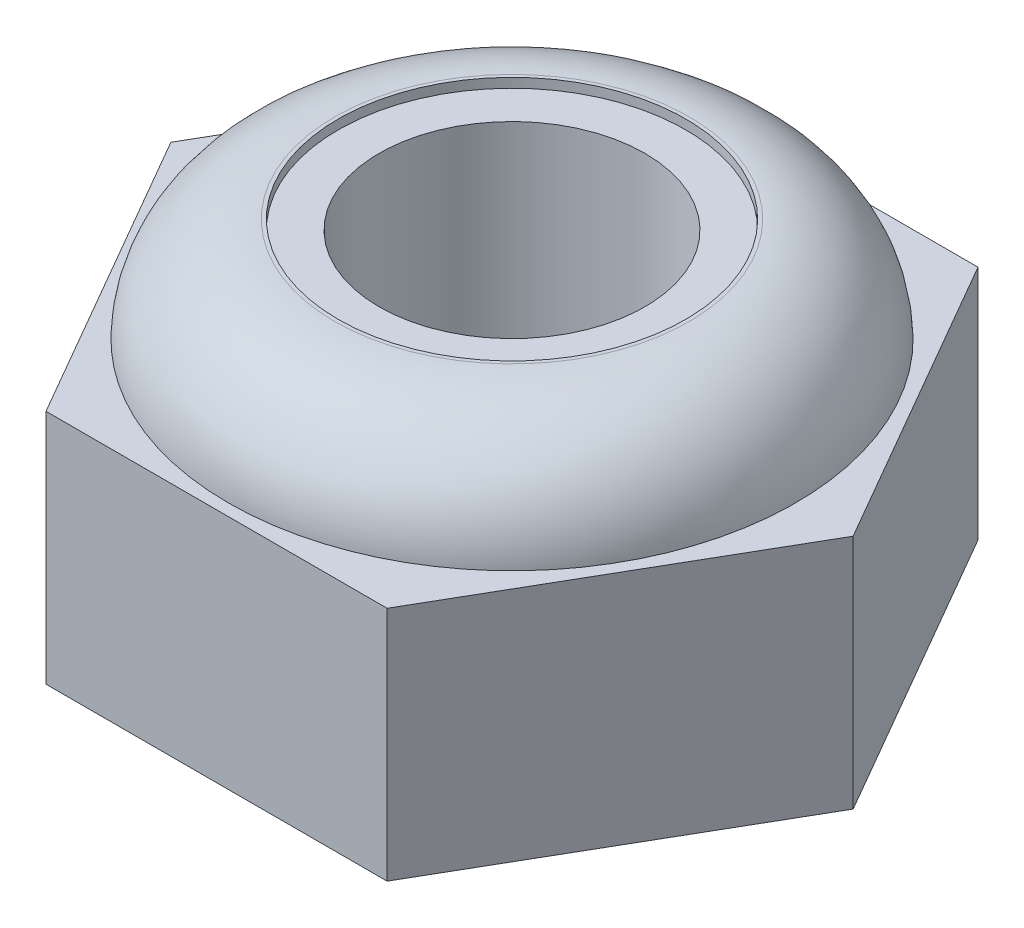
ISO-10303-21;
HEADER;
FILE_DESCRIPTION(('STEP AP214'),'2;1');
FILE_NAME('part.step','',(''),(''),'','','');
FILE_SCHEMA(('AUTOMOTIVE_DESIGN { 1 0 10303 214 1 1 1 1 }'));
ENDSEC;
DATA;
#1=APPLICATION_CONTEXT('core data for automotive mechanical design processes');
#2=APPLICATION_PROTOCOL_DEFINITION('international standard','automotive_design',2000,#1);
#3=PRODUCT_CONTEXT('',#1,'mechanical');
#4=PRODUCT('Part','Part','',(#3));
#5=PRODUCT_RELATED_PRODUCT_CATEGORY('part','',(#4));
#6=PRODUCT_DEFINITION_FORMATION('','',#4);
#7=PRODUCT_DEFINITION_CONTEXT('part definition',#1,'design');
#8=PRODUCT_DEFINITION('design','',#6,#7);
#9=PRODUCT_DEFINITION_SHAPE('','',#8);
#10=(LENGTH_UNIT() NAMED_UNIT(*) SI_UNIT(.MILLI.,.METRE.));
#11=(NAMED_UNIT(*) PLANE_ANGLE_UNIT() SI_UNIT($,.RADIAN.));
#12=(NAMED_UNIT(*) SI_UNIT($,.STERADIAN.) SOLID_ANGLE_UNIT());
#13=UNCERTAINTY_MEASURE_WITH_UNIT(LENGTH_MEASURE(1.E-05),#10,'distance_accuracy_value','');
#14=(GEOMETRIC_REPRESENTATION_CONTEXT(3) GLOBAL_UNCERTAINTY_ASSIGNED_CONTEXT((#13)) GLOBAL_UNIT_ASSIGNED_CONTEXT((#10,
#11,#12)) REPRESENTATION_CONTEXT('',''));
#15=CARTESIAN_POINT('',(0.,0.,0.));
#16=DIRECTION('',(0.,0.,1.));
#17=DIRECTION('',(1.,0.,0.));
#18=AXIS2_PLACEMENT_3D('',#15,#16,#17);
#19=CARTESIAN_POINT('',(1.8330871046771,2.54,3.17499999999998));
#20=DIRECTION('',(-0.866025403784441,0.,-0.499999999999995));
#21=DIRECTION('',(-0.499999999999995,0.,0.866025403784442));
#22=AXIS2_PLACEMENT_3D('',#19,#20,#21);
#23=PLANE('',#22);
#24=DIRECTION('',(0.499999999999995,0.,-0.866025403784442));
#25=VECTOR('',#24,1.);
#26=CARTESIAN_POINT('',(1.8330871046771,0.,3.17499999999998));
#27=LINE('',#26,#25);
#28=CARTESIAN_POINT('',(1.8330871046771,0.,3.17499999999998));
#29=VERTEX_POINT('',#28);
#30=CARTESIAN_POINT('',(3.66617420935413,0.,0.));
#31=VERTEX_POINT('',#30);
#32=EDGE_CURVE('E123',#29,#31,#27,.T.);
#33=ORIENTED_EDGE('',*,*,#32,.T.);
#34=DIRECTION('',(0.,-1.,0.));
#35=VECTOR('',#34,1.);
#36=CARTESIAN_POINT('',(3.66617420935413,2.54,0.));
#37=LINE('',#36,#35);
#38=CARTESIAN_POINT('',(3.66617420935413,2.54,0.));
#39=VERTEX_POINT('',#38);
#40=EDGE_CURVE('E141',#39,#31,#37,.T.);
#41=ORIENTED_EDGE('',*,*,#40,.F.);
#42=DIRECTION('',(0.499999999999995,0.,-0.866025403784442));
#43=VECTOR('',#42,1.);
#44=CARTESIAN_POINT('',(1.8330871046771,2.54,3.17499999999998));
#45=LINE('',#44,#43);
#46=CARTESIAN_POINT('',(1.8330871046771,2.54,3.17499999999998));
#47=VERTEX_POINT('',#46);
#48=EDGE_CURVE('E134',#47,#39,#45,.T.);
#49=ORIENTED_EDGE('',*,*,#48,.F.);
#50=DIRECTION('',(0.,-1.,0.));
#51=VECTOR('',#50,1.);
#52=CARTESIAN_POINT('',(1.8330871046771,2.54,3.17499999999998));
#53=LINE('',#52,#51);
#54=EDGE_CURVE('E119',#47,#29,#53,.T.);
#55=ORIENTED_EDGE('',*,*,#54,.T.);
#56=EDGE_LOOP('',(#33,#41,#49,#55));
#57=FACE_BOUND('',#56,.T.);
#58=ADVANCED_FACE('F37',(#57),#23,.F.);
#59=CARTESIAN_POINT('',(3.66617420935413,2.54,0.));
#60=DIRECTION('',(-0.866025403784438,0.,0.500000000000001));
#61=DIRECTION('',(0.500000000000001,0.,0.866025403784438));
#62=AXIS2_PLACEMENT_3D('',#59,#60,#61);
#63=PLANE('',#62);
#64=DIRECTION('',(-0.500000000000001,0.,-0.866025403784438));
#65=VECTOR('',#64,1.);
#66=CARTESIAN_POINT('',(3.66617420935413,0.,0.));
#67=LINE('',#66,#65);
#68=CARTESIAN_POINT('',(1.83308710467706,0.,-3.17500000000001));
#69=VERTEX_POINT('',#68);
#70=EDGE_CURVE('E126',#31,#69,#67,.T.);
#71=ORIENTED_EDGE('',*,*,#70,.T.);
#72=DIRECTION('',(0.,-1.,0.));
#73=VECTOR('',#72,1.);
#74=CARTESIAN_POINT('',(1.83308710467706,2.54,-3.17500000000001));
#75=LINE('',#74,#73);
#76=CARTESIAN_POINT('',(1.83308710467706,2.54,-3.17500000000001));
#77=VERTEX_POINT('',#76);
#78=EDGE_CURVE('E138',#77,#69,#75,.T.);
#79=ORIENTED_EDGE('',*,*,#78,.F.);
#80=DIRECTION('',(-0.500000000000001,0.,-0.866025403784438));
#81=VECTOR('',#80,1.);
#82=CARTESIAN_POINT('',(3.66617420935413,2.54,0.));
#83=LINE('',#82,#81);
#84=EDGE_CURVE('E92',#39,#77,#83,.T.);
#85=ORIENTED_EDGE('',*,*,#84,.F.);
#86=ORIENTED_EDGE('',*,*,#40,.T.);
#87=EDGE_LOOP('',(#71,#79,#85,#86));
#88=FACE_BOUND('',#87,.T.);
#89=ADVANCED_FACE('F162',(#88),#63,.F.);
#90=CARTESIAN_POINT('',(1.83308710467706,2.54,-3.17500000000001));
#91=DIRECTION('',(0.,0.,1.));
#92=DIRECTION('',(1.,0.,0.));
#93=AXIS2_PLACEMENT_3D('',#90,#91,#92);
#94=PLANE('',#93);
#95=DIRECTION('',(-1.,0.,0.));
#96=VECTOR('',#95,1.);
#97=CARTESIAN_POINT('',(1.83308710467706,0.,-3.17500000000001));
#98=LINE('',#97,#96);
#99=CARTESIAN_POINT('',(-1.83308710467708,0.,-3.17499999999999));
#100=VERTEX_POINT('',#99);
#101=EDGE_CURVE('E129',#69,#100,#98,.T.);
#102=ORIENTED_EDGE('',*,*,#101,.T.);
#103=DIRECTION('',(0.,-1.,0.));
#104=VECTOR('',#103,1.);
#105=CARTESIAN_POINT('',(-1.83308710467708,2.54,-3.17499999999999));
#106=LINE('',#105,#104);
#107=CARTESIAN_POINT('',(-1.83308710467708,2.54,-3.17499999999999));
#108=VERTEX_POINT('',#107);
#109=EDGE_CURVE('E114',#108,#100,#106,.T.);
#110=ORIENTED_EDGE('',*,*,#109,.F.);
#111=DIRECTION('',(-1.,0.,0.));
#112=VECTOR('',#111,1.);
#113=CARTESIAN_POINT('',(1.83308710467706,2.54,-3.17500000000001));
#114=LINE('',#113,#112);
#115=EDGE_CURVE('E105',#77,#108,#114,.T.);
#116=ORIENTED_EDGE('',*,*,#115,.F.);
#117=ORIENTED_EDGE('',*,*,#78,.T.);
#118=EDGE_LOOP('',(#102,#110,#116,#117));
#119=FACE_BOUND('',#118,.T.);
#120=ADVANCED_FACE('F167',(#119),#94,.F.);
#121=CARTESIAN_POINT('',(-1.83308710467708,2.54,-3.17499999999999));
#122=DIRECTION('',(0.866025403784442,0.,0.499999999999995));
#123=DIRECTION('',(0.499999999999995,0.,-0.866025403784442));
#124=AXIS2_PLACEMENT_3D('',#121,#122,#123);
#125=PLANE('',#124);
#126=DIRECTION('',(-0.499999999999995,0.,0.866025403784441));
#127=VECTOR('',#126,1.);
#128=CARTESIAN_POINT('',(-1.83308710467708,0.,-3.17499999999999));
#129=LINE('',#128,#127);
#130=CARTESIAN_POINT('',(-3.66617420935413,0.,0.));
#131=VERTEX_POINT('',#130);
#132=EDGE_CURVE('E113',#100,#131,#129,.T.);
#133=ORIENTED_EDGE('',*,*,#132,.T.);
#134=DIRECTION('',(0.,-1.,0.));
#135=VECTOR('',#134,1.);
#136=CARTESIAN_POINT('',(-3.66617420935413,2.54,0.));
#137=LINE('',#136,#135);
#138=CARTESIAN_POINT('',(-3.66617420935413,2.54,0.));
#139=VERTEX_POINT('',#138);
#140=EDGE_CURVE('E110',#139,#131,#137,.T.);
#141=ORIENTED_EDGE('',*,*,#140,.F.);
#142=DIRECTION('',(-0.499999999999995,0.,0.866025403784441));
#143=VECTOR('',#142,1.);
#144=CARTESIAN_POINT('',(-1.83308710467708,2.54,-3.17499999999999));
#145=LINE('',#144,#143);
#146=EDGE_CURVE('E99',#108,#139,#145,.T.);
#147=ORIENTED_EDGE('',*,*,#146,.F.);
#148=ORIENTED_EDGE('',*,*,#109,.T.);
#149=EDGE_LOOP('',(#133,#141,#147,#148));
#150=FACE_BOUND('',#149,.T.);
#151=ADVANCED_FACE('F111',(#150),#125,.F.);
#152=CARTESIAN_POINT('',(-3.66617420935413,2.54,0.));
#153=DIRECTION('',(0.866025403784434,0.,-0.500000000000007));
#154=DIRECTION('',(-0.500000000000007,0.,-0.866025403784435));
#155=AXIS2_PLACEMENT_3D('',#152,#153,#154);
#156=PLANE('',#155);
#157=DIRECTION('',(0.500000000000007,0.,0.866025403784435));
#158=VECTOR('',#157,1.);
#159=CARTESIAN_POINT('',(-3.66617420935413,0.,0.));
#160=LINE('',#159,#158);
#161=CARTESIAN_POINT('',(-1.83308710467703,0.,3.17500000000002));
#162=VERTEX_POINT('',#161);
#163=EDGE_CURVE('E77',#131,#162,#160,.T.);
#164=ORIENTED_EDGE('',*,*,#163,.T.);
#165=DIRECTION('',(0.,-1.,0.));
#166=VECTOR('',#165,1.);
#167=CARTESIAN_POINT('',(-1.83308710467703,2.54,3.17500000000002));
#168=LINE('',#167,#166);
#169=CARTESIAN_POINT('',(-1.83308710467703,2.54,3.17500000000002));
#170=VERTEX_POINT('',#169);
#171=EDGE_CURVE('E115',#170,#162,#168,.T.);
#172=ORIENTED_EDGE('',*,*,#171,.F.);
#173=DIRECTION('',(0.500000000000007,0.,0.866025403784435));
#174=VECTOR('',#173,1.);
#175=CARTESIAN_POINT('',(-3.66617420935413,2.54,0.));
#176=LINE('',#175,#174);
#177=EDGE_CURVE('E103',#139,#170,#176,.T.);
#178=ORIENTED_EDGE('',*,*,#177,.F.);
#179=ORIENTED_EDGE('',*,*,#140,.T.);
#180=EDGE_LOOP('',(#164,#172,#178,#179));
#181=FACE_BOUND('',#180,.T.);
#182=ADVANCED_FACE('F117',(#181),#156,.F.);
#183=CARTESIAN_POINT('',(-1.83308710467703,2.54,3.17500000000002));
#184=DIRECTION('',(0.,0.,-1.));
#185=DIRECTION('',(-1.,0.,0.));
#186=AXIS2_PLACEMENT_3D('',#183,#184,#185);
#187=PLANE('',#186);
#188=DIRECTION('',(1.,0.,0.));
#189=VECTOR('',#188,1.);
#190=CARTESIAN_POINT('',(-1.83308710467703,0.,3.17500000000002));
#191=LINE('',#190,#189);
#192=EDGE_CURVE('E83',#162,#29,#191,.T.);
#193=ORIENTED_EDGE('',*,*,#192,.T.);
#194=ORIENTED_EDGE('',*,*,#54,.F.);
#195=DIRECTION('',(1.,0.,0.));
#196=VECTOR('',#195,1.);
#197=CARTESIAN_POINT('',(-1.83308710467703,2.54,3.17500000000002));
#198=LINE('',#197,#196);
#199=EDGE_CURVE('E54',#170,#47,#198,.T.);
#200=ORIENTED_EDGE('',*,*,#199,.F.);
#201=ORIENTED_EDGE('',*,*,#171,.T.);
#202=EDGE_LOOP('',(#193,#194,#200,#201));
#203=FACE_BOUND('',#202,.T.);
#204=ADVANCED_FACE('F177',(#203),#187,.F.);
#205=CARTESIAN_POINT('',(0.,2.54,0.));
#206=DIRECTION('',(0.,1.,0.));
#207=DIRECTION('',(0.,0.,1.));
#208=AXIS2_PLACEMENT_3D('',#205,#206,#207);
#209=PLANE('',#208);
#210=CARTESIAN_POINT('',(0.,2.54,0.));
#211=DIRECTION('',(0.,1.,0.));
#212=DIRECTION('',(0.,0.,1.));
#213=AXIS2_PLACEMENT_3D('',#210,#211,#212);
#214=CIRCLE('',#213,3.048);
#215=CARTESIAN_POINT('',(0.,2.54,3.048));
#216=VERTEX_POINT('',#215);
#217=EDGE_CURVE('E127',#216,#216,#214,.T.);
#218=ORIENTED_EDGE('',*,*,#217,.F.);
#219=EDGE_LOOP('',(#218));
#220=FACE_BOUND('',#219,.T.);
#221=ORIENTED_EDGE('',*,*,#48,.T.);
#222=ORIENTED_EDGE('',*,*,#84,.T.);
#223=ORIENTED_EDGE('',*,*,#115,.T.);
#224=ORIENTED_EDGE('',*,*,#146,.T.);
#225=ORIENTED_EDGE('',*,*,#177,.T.);
#226=ORIENTED_EDGE('',*,*,#199,.T.);
#227=EDGE_LOOP('',(#221,#222,#223,#224,#225,#226));
#228=FACE_BOUND('',#227,.T.);
#229=ADVANCED_FACE('F101',(#220,#228),#209,.T.);
#230=CARTESIAN_POINT('',(0.,0.,0.));
#231=DIRECTION('',(0.,1.,0.));
#232=DIRECTION('',(0.,0.,1.));
#233=AXIS2_PLACEMENT_3D('',#230,#231,#232);
#234=PLANE('',#233);
#235=CARTESIAN_POINT('',(0.,0.,0.));
#236=DIRECTION('',(0.,1.,0.));
#237=DIRECTION('',(0.,0.,1.));
#238=AXIS2_PLACEMENT_3D('',#235,#236,#237);
#239=CIRCLE('',#238,1.42875);
#240=CARTESIAN_POINT('',(0.,0.,1.42875));
#241=VERTEX_POINT('',#240);
#242=EDGE_CURVE('E200',#241,#241,#239,.T.);
#243=ORIENTED_EDGE('',*,*,#242,.T.);
#244=EDGE_LOOP('',(#243));
#245=FACE_BOUND('',#244,.T.);
#246=ORIENTED_EDGE('',*,*,#32,.F.);
#247=ORIENTED_EDGE('',*,*,#192,.F.);
#248=ORIENTED_EDGE('',*,*,#163,.F.);
#249=ORIENTED_EDGE('',*,*,#132,.F.);
#250=ORIENTED_EDGE('',*,*,#101,.F.);
#251=ORIENTED_EDGE('',*,*,#70,.F.);
#252=EDGE_LOOP('',(#246,#247,#248,#249,#250,#251));
#253=FACE_BOUND('',#252,.T.);
#254=ADVANCED_FACE('F180',(#245,#253),#234,.F.);
#255=CARTESIAN_POINT('',(0.,15.9362458762264,0.));
#256=DIRECTION('',(0.,-1.,0.));
#257=DIRECTION('',(0.,0.,-1.));
#258=AXIS2_PLACEMENT_3D('',#255,#256,#257);
#259=CYLINDRICAL_SURFACE('',#258,1.8669);
#260=CARTESIAN_POINT('',(0.,3.556,0.));
#261=DIRECTION('',(0.,1.,0.));
#262=DIRECTION('',(0.,0.,1.));
#263=AXIS2_PLACEMENT_3D('',#260,#261,#262);
#264=CIRCLE('',#263,1.8669);
#265=CARTESIAN_POINT('',(0.,3.556,1.8669));
#266=VERTEX_POINT('',#265);
#267=EDGE_CURVE('E12',#266,#266,#264,.T.);
#268=ORIENTED_EDGE('',*,*,#267,.F.);
#269=EDGE_LOOP('',(#268));
#270=FACE_BOUND('',#269,.T.);
#271=CARTESIAN_POINT('',(0.,3.6576,0.));
#272=DIRECTION('',(0.,1.,0.));
#273=DIRECTION('',(0.,0.,1.));
#274=AXIS2_PLACEMENT_3D('',#271,#272,#273);
#275=CIRCLE('',#274,1.8669);
#276=CARTESIAN_POINT('',(0.,3.6576,1.8669));
#277=VERTEX_POINT('',#276);
#278=EDGE_CURVE('E202',#277,#277,#275,.T.);
#279=ORIENTED_EDGE('',*,*,#278,.T.);
#280=EDGE_LOOP('',(#279));
#281=FACE_BOUND('',#280,.T.);
#282=ADVANCED_FACE('F158',(#270,#281),#259,.F.);
#283=CARTESIAN_POINT('',(0.,3.6576,0.));
#284=DIRECTION('',(0.,1.,0.));
#285=DIRECTION('',(0.,0.,1.));
#286=AXIS2_PLACEMENT_3D('',#283,#284,#285);
#287=PLANE('',#286);
#288=CARTESIAN_POINT('',(0.,3.6576,0.));
#289=DIRECTION('',(0.,1.,0.));
#290=DIRECTION('',(0.,0.,1.));
#291=AXIS2_PLACEMENT_3D('',#288,#289,#290);
#292=CIRCLE('',#291,1.90528225707308);
#293=CARTESIAN_POINT('',(0.,3.6576,1.90528225707308));
#294=VERTEX_POINT('',#293);
#295=EDGE_CURVE('E46',#294,#294,#292,.T.);
#296=ORIENTED_EDGE('',*,*,#295,.T.);
#297=EDGE_LOOP('',(#296));
#298=FACE_BOUND('',#297,.T.);
#299=ORIENTED_EDGE('',*,*,#278,.F.);
#300=EDGE_LOOP('',(#299));
#301=FACE_BOUND('',#300,.T.);
#302=ADVANCED_FACE('F145',(#298,#301),#287,.T.);
#303=CARTESIAN_POINT('',(0.,2.5146,0.));
#304=DIRECTION('',(0.,-1.,0.));
#305=DIRECTION('',(0.,0.,-1.));
#306=AXIS2_PLACEMENT_3D('',#303,#304,#305);
#307=TOROIDAL_SURFACE('',#306,1.90528225707308,1.143);
#308=ORIENTED_EDGE('',*,*,#217,.T.);
#309=EDGE_LOOP('',(#308));
#310=FACE_BOUND('',#309,.T.);
#311=ORIENTED_EDGE('',*,*,#295,.F.);
#312=EDGE_LOOP('',(#311));
#313=FACE_BOUND('',#312,.T.);
#314=ADVANCED_FACE('F39',(#310,#313),#307,.T.);
#315=CARTESIAN_POINT('',(0.,3.556,0.));
#316=DIRECTION('',(0.,1.,0.));
#317=DIRECTION('',(0.,0.,1.));
#318=AXIS2_PLACEMENT_3D('',#315,#316,#317);
#319=PLANE('',#318);
#320=ORIENTED_EDGE('',*,*,#267,.T.);
#321=EDGE_LOOP('',(#320));
#322=FACE_BOUND('',#321,.T.);
#323=CARTESIAN_POINT('',(0.,3.556,0.));
#324=DIRECTION('',(0.,1.,0.));
#325=DIRECTION('',(0.,0.,1.));
#326=AXIS2_PLACEMENT_3D('',#323,#324,#325);
#327=CIRCLE('',#326,1.42875);
#328=CARTESIAN_POINT('',(0.,3.556,1.42875));
#329=VERTEX_POINT('',#328);
#330=EDGE_CURVE('E197',#329,#329,#327,.T.);
#331=ORIENTED_EDGE('',*,*,#330,.F.);
#332=EDGE_LOOP('',(#331));
#333=FACE_BOUND('',#332,.T.);
#334=ADVANCED_FACE('F149',(#322,#333),#319,.T.);
#335=CARTESIAN_POINT('',(0.,3.556,0.));
#336=DIRECTION('',(0.,-1.,0.));
#337=DIRECTION('',(0.,0.,-1.));
#338=AXIS2_PLACEMENT_3D('',#335,#336,#337);
#339=CYLINDRICAL_SURFACE('',#338,1.42875);
#340=ORIENTED_EDGE('',*,*,#330,.T.);
#341=EDGE_LOOP('',(#340));
#342=FACE_BOUND('',#341,.T.);
#343=ORIENTED_EDGE('',*,*,#242,.F.);
#344=EDGE_LOOP('',(#343));
#345=FACE_BOUND('',#344,.T.);
#346=ADVANCED_FACE('F155',(#342,#345),#339,.F.);
#347=CLOSED_SHELL('',(#58,#89,#120,#151,#182,#204,#229,#254,#282,#302,#314,#334,#346));
#348=MANIFOLD_SOLID_BREP('B2',#347);
#349=ADVANCED_BREP_SHAPE_REPRESENTATION('',(#18,#348),#14);
#350=SHAPE_DEFINITION_REPRESENTATION(#9,#349);
ENDSEC;
END-ISO-10303-21;
